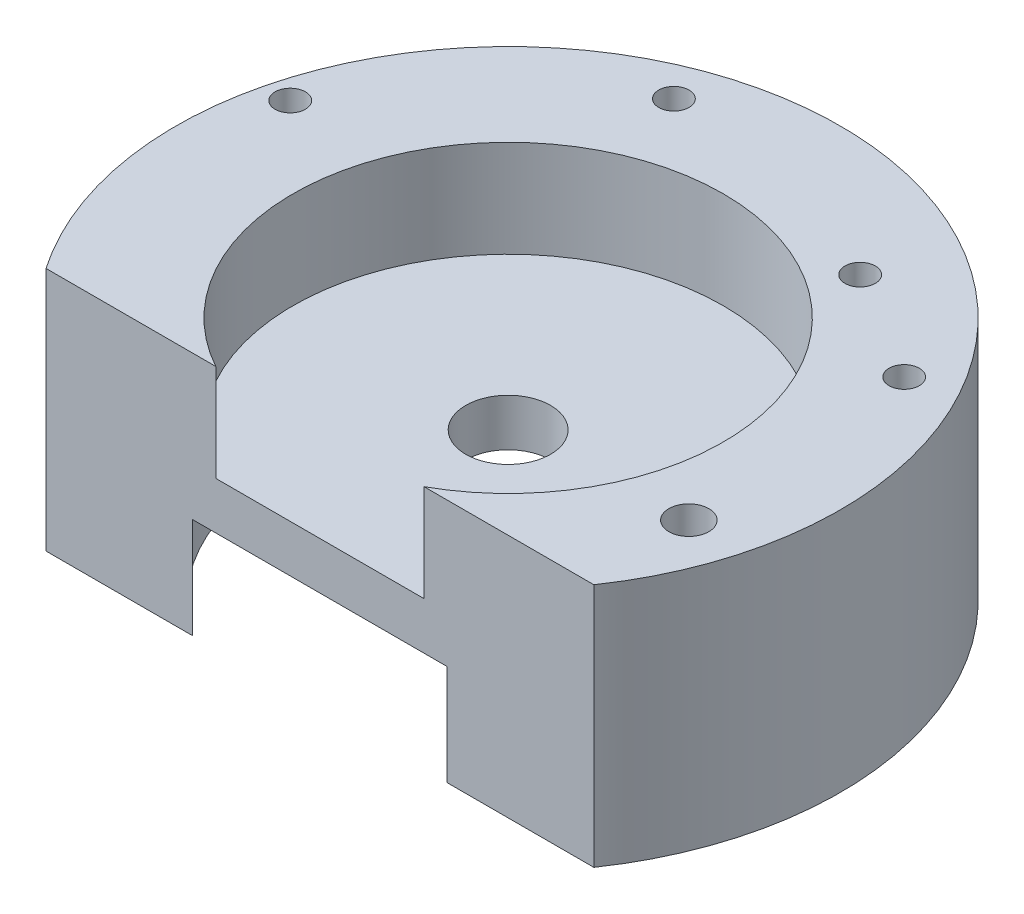
ISO-10303-21;
HEADER;
FILE_DESCRIPTION(('STEP AP214'),'2;1');
FILE_NAME('part.step','',(''),(''),'','','');
FILE_SCHEMA(('AUTOMOTIVE_DESIGN { 1 0 10303 214 1 1 1 1 }'));
ENDSEC;
DATA;
#1=APPLICATION_CONTEXT('core data for automotive mechanical design processes');
#2=APPLICATION_PROTOCOL_DEFINITION('international standard','automotive_design',2000,#1);
#3=PRODUCT_CONTEXT('',#1,'mechanical');
#4=PRODUCT('Part','Part','',(#3));
#5=PRODUCT_RELATED_PRODUCT_CATEGORY('part','',(#4));
#6=PRODUCT_DEFINITION_FORMATION('','',#4);
#7=PRODUCT_DEFINITION_CONTEXT('part definition',#1,'design');
#8=PRODUCT_DEFINITION('design','',#6,#7);
#9=PRODUCT_DEFINITION_SHAPE('','',#8);
#10=(LENGTH_UNIT() NAMED_UNIT(*) SI_UNIT(.MILLI.,.METRE.));
#11=(NAMED_UNIT(*) PLANE_ANGLE_UNIT() SI_UNIT($,.RADIAN.));
#12=(NAMED_UNIT(*) SI_UNIT($,.STERADIAN.) SOLID_ANGLE_UNIT());
#13=UNCERTAINTY_MEASURE_WITH_UNIT(LENGTH_MEASURE(1.E-05),#10,'distance_accuracy_value','');
#14=(GEOMETRIC_REPRESENTATION_CONTEXT(3) GLOBAL_UNCERTAINTY_ASSIGNED_CONTEXT((#13)) GLOBAL_UNIT_ASSIGNED_CONTEXT((#10,
#11,#12)) REPRESENTATION_CONTEXT('',''));
#15=CARTESIAN_POINT('',(0.,0.,0.));
#16=DIRECTION('',(0.,0.,1.));
#17=DIRECTION('',(1.,0.,0.));
#18=AXIS2_PLACEMENT_3D('',#15,#16,#17);
#19=CARTESIAN_POINT('',(0.,0.,0.));
#20=DIRECTION('',(0.,-1.,0.));
#21=DIRECTION('',(0.,0.,-1.));
#22=AXIS2_PLACEMENT_3D('',#19,#20,#21);
#23=CYLINDRICAL_SURFACE('',#22,27.425);
#24=CARTESIAN_POINT('',(0.,20.2,0.));
#25=DIRECTION('',(0.,-1.,0.));
#26=DIRECTION('',(0.,0.,-1.));
#27=AXIS2_PLACEMENT_3D('',#24,#25,#26);
#28=CIRCLE('',#27,27.425);
#29=CARTESIAN_POINT('',(-22.6032024126272,20.2,15.5314476367724));
#30=VERTEX_POINT('',#29);
#31=CARTESIAN_POINT('',(22.6032024126272,20.2,15.5314476367724));
#32=VERTEX_POINT('',#31);
#33=EDGE_CURVE('E131',#30,#32,#28,.T.);
#34=ORIENTED_EDGE('',*,*,#33,.T.);
#35=DIRECTION('',(0.,-1.,0.));
#36=VECTOR('',#35,1.);
#37=CARTESIAN_POINT('',(22.6032024126272,20.2,15.5314476367724));
#38=LINE('',#37,#36);
#39=CARTESIAN_POINT('',(22.6032024126272,0.,15.5314476367724));
#40=VERTEX_POINT('',#39);
#41=EDGE_CURVE('E53',#32,#40,#38,.T.);
#42=ORIENTED_EDGE('',*,*,#41,.T.);
#43=CARTESIAN_POINT('',(0.,0.,0.));
#44=DIRECTION('',(0.,-1.,0.));
#45=DIRECTION('',(0.,0.,-1.));
#46=AXIS2_PLACEMENT_3D('',#43,#44,#45);
#47=CIRCLE('',#46,27.425);
#48=CARTESIAN_POINT('',(-22.6032024126272,0.,15.5314476367724));
#49=VERTEX_POINT('',#48);
#50=EDGE_CURVE('E46',#49,#40,#47,.T.);
#51=ORIENTED_EDGE('',*,*,#50,.F.);
#52=DIRECTION('',(0.,-1.,0.));
#53=VECTOR('',#52,1.);
#54=CARTESIAN_POINT('',(-22.6032024126272,20.2,15.5314476367724));
#55=LINE('',#54,#53);
#56=EDGE_CURVE('E112',#30,#49,#55,.T.);
#57=ORIENTED_EDGE('',*,*,#56,.F.);
#58=EDGE_LOOP('',(#34,#42,#51,#57));
#59=FACE_BOUND('',#58,.T.);
#60=ADVANCED_FACE('F39',(#59),#23,.T.);
#61=CARTESIAN_POINT('',(-27.425,0.,0.));
#62=DIRECTION('',(0.,1.,0.));
#63=DIRECTION('',(0.,0.,1.));
#64=AXIS2_PLACEMENT_3D('',#61,#62,#63);
#65=PLANE('',#64);
#66=CARTESIAN_POINT('',(21.9096162425014,0.,6.99776507938924));
#67=DIRECTION('',(0.,-1.,0.));
#68=DIRECTION('',(0.,0.,-1.));
#69=AXIS2_PLACEMENT_3D('',#66,#67,#68);
#70=CIRCLE('',#69,1.65);
#71=CARTESIAN_POINT('',(21.9096162425014,0.,5.34776507938925));
#72=VERTEX_POINT('',#71);
#73=EDGE_CURVE('E196',#72,#72,#70,.T.);
#74=ORIENTED_EDGE('',*,*,#73,.F.);
#75=EDGE_LOOP('',(#74));
#76=FACE_BOUND('',#75,.T.);
#77=ORIENTED_EDGE('',*,*,#50,.T.);
#78=DIRECTION('',(1.,0.,0.));
#79=VECTOR('',#78,1.);
#80=CARTESIAN_POINT('',(22.6032024126272,0.,15.5314476367724));
#81=LINE('',#80,#79);
#82=CARTESIAN_POINT('',(10.5041246330286,0.,15.5314476367724));
#83=VERTEX_POINT('',#82);
#84=EDGE_CURVE('E100',#83,#40,#81,.T.);
#85=ORIENTED_EDGE('',*,*,#84,.F.);
#86=CARTESIAN_POINT('',(0.,0.,0.));
#87=DIRECTION('',(0.,-1.,0.));
#88=DIRECTION('',(0.,0.,-1.));
#89=AXIS2_PLACEMENT_3D('',#86,#87,#88);
#90=CIRCLE('',#89,18.75);
#91=CARTESIAN_POINT('',(-10.5041246330286,0.,15.5314476367724));
#92=VERTEX_POINT('',#91);
#93=EDGE_CURVE('E149',#92,#83,#90,.T.);
#94=ORIENTED_EDGE('',*,*,#93,.F.);
#95=EDGE_CURVE('E103',#49,#92,#81,.T.);
#96=ORIENTED_EDGE('',*,*,#95,.F.);
#97=EDGE_LOOP('',(#77,#85,#94,#96));
#98=FACE_BOUND('',#97,.T.);
#99=ADVANCED_FACE('F156',(#76,#98),#65,.F.);
#100=CARTESIAN_POINT('',(0.,0.,0.));
#101=DIRECTION('',(0.,-1.,0.));
#102=DIRECTION('',(0.,0.,-1.));
#103=AXIS2_PLACEMENT_3D('',#100,#101,#102);
#104=CYLINDRICAL_SURFACE('',#103,18.75);
#105=ORIENTED_EDGE('',*,*,#93,.T.);
#106=DIRECTION('',(0.,-1.,0.));
#107=VECTOR('',#106,1.);
#108=CARTESIAN_POINT('',(10.5041246330286,0.,15.5314476367724));
#109=LINE('',#108,#107);
#110=CARTESIAN_POINT('',(10.5041246330286,8.3,15.5314476367724));
#111=VERTEX_POINT('',#110);
#112=EDGE_CURVE('E128',#83,#111,#109,.F.);
#113=ORIENTED_EDGE('',*,*,#112,.T.);
#114=CARTESIAN_POINT('',(0.,8.3,0.));
#115=DIRECTION('',(0.,-1.,0.));
#116=DIRECTION('',(0.,0.,-1.));
#117=AXIS2_PLACEMENT_3D('',#114,#115,#116);
#118=CIRCLE('',#117,18.75);
#119=CARTESIAN_POINT('',(-10.5041246330286,8.3,15.5314476367724));
#120=VERTEX_POINT('',#119);
#121=EDGE_CURVE('E146',#120,#111,#118,.T.);
#122=ORIENTED_EDGE('',*,*,#121,.F.);
#123=DIRECTION('',(0.,-1.,0.));
#124=VECTOR('',#123,1.);
#125=CARTESIAN_POINT('',(-10.5041246330286,0.,15.5314476367724));
#126=LINE('',#125,#124);
#127=EDGE_CURVE('E59',#120,#92,#126,.T.);
#128=ORIENTED_EDGE('',*,*,#127,.T.);
#129=EDGE_LOOP('',(#105,#113,#122,#128));
#130=FACE_BOUND('',#129,.T.);
#131=ADVANCED_FACE('F172',(#130),#104,.F.);
#132=CARTESIAN_POINT('',(-18.75,8.3,0.));
#133=DIRECTION('',(0.,1.,0.));
#134=DIRECTION('',(0.,0.,1.));
#135=AXIS2_PLACEMENT_3D('',#132,#133,#134);
#136=PLANE('',#135);
#137=CARTESIAN_POINT('',(0.,8.3,0.));
#138=DIRECTION('',(0.,-1.,0.));
#139=DIRECTION('',(0.,0.,-1.));
#140=AXIS2_PLACEMENT_3D('',#137,#138,#139);
#141=CIRCLE('',#140,3.5);
#142=CARTESIAN_POINT('',(0.,8.3,-3.5));
#143=VERTEX_POINT('',#142);
#144=EDGE_CURVE('E143',#143,#143,#141,.T.);
#145=ORIENTED_EDGE('',*,*,#144,.F.);
#146=EDGE_LOOP('',(#145));
#147=FACE_BOUND('',#146,.T.);
#148=ORIENTED_EDGE('',*,*,#121,.T.);
#149=DIRECTION('',(-1.,0.,0.));
#150=VECTOR('',#149,1.);
#151=CARTESIAN_POINT('',(-18.75,8.3,15.5314476367724));
#152=LINE('',#151,#150);
#153=EDGE_CURVE('E125',#111,#120,#152,.T.);
#154=ORIENTED_EDGE('',*,*,#153,.T.);
#155=EDGE_LOOP('',(#148,#154));
#156=FACE_BOUND('',#155,.T.);
#157=ADVANCED_FACE('F174',(#147,#156),#136,.F.);
#158=CARTESIAN_POINT('',(0.,0.,0.));
#159=DIRECTION('',(0.,-1.,0.));
#160=DIRECTION('',(0.,0.,-1.));
#161=AXIS2_PLACEMENT_3D('',#158,#159,#160);
#162=CYLINDRICAL_SURFACE('',#161,3.5);
#163=CARTESIAN_POINT('',(0.,12.2,0.));
#164=DIRECTION('',(0.,-1.,0.));
#165=DIRECTION('',(0.,0.,-1.));
#166=AXIS2_PLACEMENT_3D('',#163,#164,#165);
#167=CIRCLE('',#166,3.5);
#168=CARTESIAN_POINT('',(0.,12.2,-3.5));
#169=VERTEX_POINT('',#168);
#170=EDGE_CURVE('E140',#169,#169,#167,.T.);
#171=ORIENTED_EDGE('',*,*,#170,.F.);
#172=EDGE_LOOP('',(#171));
#173=FACE_BOUND('',#172,.T.);
#174=ORIENTED_EDGE('',*,*,#144,.T.);
#175=EDGE_LOOP('',(#174));
#176=FACE_BOUND('',#175,.T.);
#177=ADVANCED_FACE('F176',(#173,#176),#162,.F.);
#178=CARTESIAN_POINT('',(-3.5,12.2,0.));
#179=DIRECTION('',(0.,-1.,0.));
#180=DIRECTION('',(0.,0.,-1.));
#181=AXIS2_PLACEMENT_3D('',#178,#179,#180);
#182=PLANE('',#181);
#183=CARTESIAN_POINT('',(0.,12.2,0.));
#184=DIRECTION('',(0.,-1.,0.));
#185=DIRECTION('',(0.,0.,-1.));
#186=AXIS2_PLACEMENT_3D('',#183,#184,#185);
#187=CIRCLE('',#186,17.75);
#188=CARTESIAN_POINT('',(-8.59282458253381,12.2,15.5314476367724));
#189=VERTEX_POINT('',#188);
#190=CARTESIAN_POINT('',(8.59282458253381,12.2,15.5314476367724));
#191=VERTEX_POINT('',#190);
#192=EDGE_CURVE('E137',#189,#191,#187,.T.);
#193=ORIENTED_EDGE('',*,*,#192,.F.);
#194=DIRECTION('',(1.,0.,0.));
#195=VECTOR('',#194,1.);
#196=CARTESIAN_POINT('',(-3.5,12.2,15.5314476367724));
#197=LINE('',#196,#195);
#198=EDGE_CURVE('E119',#189,#191,#197,.T.);
#199=ORIENTED_EDGE('',*,*,#198,.T.);
#200=EDGE_LOOP('',(#193,#199));
#201=FACE_BOUND('',#200,.T.);
#202=ORIENTED_EDGE('',*,*,#170,.T.);
#203=EDGE_LOOP('',(#202));
#204=FACE_BOUND('',#203,.T.);
#205=ADVANCED_FACE('F168',(#201,#204),#182,.F.);
#206=CARTESIAN_POINT('',(0.,0.,0.));
#207=DIRECTION('',(0.,-1.,0.));
#208=DIRECTION('',(0.,0.,-1.));
#209=AXIS2_PLACEMENT_3D('',#206,#207,#208);
#210=CYLINDRICAL_SURFACE('',#209,17.75);
#211=ORIENTED_EDGE('',*,*,#192,.T.);
#212=DIRECTION('',(0.,-1.,0.));
#213=VECTOR('',#212,1.);
#214=CARTESIAN_POINT('',(8.59282458253381,0.,15.5314476367724));
#215=LINE('',#214,#213);
#216=CARTESIAN_POINT('',(8.59282458253382,20.2,15.5314476367724));
#217=VERTEX_POINT('',#216);
#218=EDGE_CURVE('E122',#191,#217,#215,.F.);
#219=ORIENTED_EDGE('',*,*,#218,.T.);
#220=CARTESIAN_POINT('',(0.,20.2,0.));
#221=DIRECTION('',(0.,-1.,0.));
#222=DIRECTION('',(0.,0.,-1.));
#223=AXIS2_PLACEMENT_3D('',#220,#221,#222);
#224=CIRCLE('',#223,17.75);
#225=CARTESIAN_POINT('',(-8.59282458253382,20.2,15.5314476367724));
#226=VERTEX_POINT('',#225);
#227=EDGE_CURVE('E134',#226,#217,#224,.T.);
#228=ORIENTED_EDGE('',*,*,#227,.F.);
#229=DIRECTION('',(0.,-1.,0.));
#230=VECTOR('',#229,1.);
#231=CARTESIAN_POINT('',(-8.59282458253381,0.,15.5314476367724));
#232=LINE('',#231,#230);
#233=EDGE_CURVE('E115',#226,#189,#232,.T.);
#234=ORIENTED_EDGE('',*,*,#233,.T.);
#235=EDGE_LOOP('',(#211,#219,#228,#234));
#236=FACE_BOUND('',#235,.T.);
#237=ADVANCED_FACE('F165',(#236),#210,.F.);
#238=CARTESIAN_POINT('',(-17.75,20.2,0.));
#239=DIRECTION('',(0.,-1.,0.));
#240=DIRECTION('',(0.,0.,-1.));
#241=AXIS2_PLACEMENT_3D('',#238,#239,#240);
#242=PLANE('',#241);
#243=CARTESIAN_POINT('',(21.9096162425014,20.2,6.99776507938924));
#244=DIRECTION('',(0.,-1.,0.));
#245=DIRECTION('',(0.,0.,-1.));
#246=AXIS2_PLACEMENT_3D('',#243,#244,#245);
#247=CIRCLE('',#246,1.65);
#248=CARTESIAN_POINT('',(21.9096162425014,20.2,5.34776507938925));
#249=VERTEX_POINT('',#248);
#250=EDGE_CURVE('E198',#249,#249,#247,.T.);
#251=ORIENTED_EDGE('',*,*,#250,.T.);
#252=EDGE_LOOP('',(#251));
#253=FACE_BOUND('',#252,.T.);
#254=CARTESIAN_POINT('',(20.5618746377783,20.2,-12.1185523632276));
#255=DIRECTION('',(0.,-1.,0.));
#256=DIRECTION('',(0.,0.,-1.));
#257=AXIS2_PLACEMENT_3D('',#254,#255,#256);
#258=CIRCLE('',#257,1.25);
#259=CARTESIAN_POINT('',(20.5618746377783,20.2,-13.3685523632276));
#260=VERTEX_POINT('',#259);
#261=EDGE_CURVE('E206',#260,#260,#258,.T.);
#262=ORIENTED_EDGE('',*,*,#261,.T.);
#263=EDGE_LOOP('',(#262));
#264=FACE_BOUND('',#263,.T.);
#265=CARTESIAN_POINT('',(-8.82232836780858,20.2,-22.5009226959821));
#266=DIRECTION('',(0.,-1.,0.));
#267=DIRECTION('',(0.,0.,-1.));
#268=AXIS2_PLACEMENT_3D('',#265,#266,#267);
#269=CIRCLE('',#268,1.25);
#270=CARTESIAN_POINT('',(-8.82232836780858,20.2,-23.7509226959821));
#271=VERTEX_POINT('',#270);
#272=EDGE_CURVE('E212',#271,#271,#269,.T.);
#273=ORIENTED_EDGE('',*,*,#272,.T.);
#274=EDGE_LOOP('',(#273));
#275=FACE_BOUND('',#274,.T.);
#276=CARTESIAN_POINT('',(-24.5224357736982,20.2,-6.54106594714093));
#277=DIRECTION('',(0.,-1.,0.));
#278=DIRECTION('',(0.,0.,-1.));
#279=AXIS2_PLACEMENT_3D('',#276,#277,#278);
#280=CIRCLE('',#279,1.25);
#281=CARTESIAN_POINT('',(-24.5224357736982,20.2,-7.79106594714093));
#282=VERTEX_POINT('',#281);
#283=EDGE_CURVE('E201',#282,#282,#280,.T.);
#284=ORIENTED_EDGE('',*,*,#283,.T.);
#285=EDGE_LOOP('',(#284));
#286=FACE_BOUND('',#285,.T.);
#287=CARTESIAN_POINT('',(11.4353989661859,20.2,-17.6133940648631));
#288=DIRECTION('',(0.,1.,0.));
#289=DIRECTION('',(0.,0.,1.));
#290=AXIS2_PLACEMENT_3D('',#287,#288,#289);
#291=CIRCLE('',#290,1.24999999999999);
#292=CARTESIAN_POINT('',(11.4353989661859,20.2,-16.3633940648631));
#293=VERTEX_POINT('',#292);
#294=EDGE_CURVE('E101',#293,#293,#291,.T.);
#295=ORIENTED_EDGE('',*,*,#294,.F.);
#296=EDGE_LOOP('',(#295));
#297=FACE_BOUND('',#296,.T.);
#298=ORIENTED_EDGE('',*,*,#33,.F.);
#299=DIRECTION('',(1.,0.,0.));
#300=VECTOR('',#299,1.);
#301=CARTESIAN_POINT('',(22.6032024126272,20.2,15.5314476367724));
#302=LINE('',#301,#300);
#303=EDGE_CURVE('E110',#30,#226,#302,.T.);
#304=ORIENTED_EDGE('',*,*,#303,.T.);
#305=ORIENTED_EDGE('',*,*,#227,.T.);
#306=DIRECTION('',(1.,0.,0.));
#307=VECTOR('',#306,1.);
#308=CARTESIAN_POINT('',(-17.75,20.2,15.5314476367724));
#309=LINE('',#308,#307);
#310=EDGE_CURVE('E11',#217,#32,#309,.T.);
#311=ORIENTED_EDGE('',*,*,#310,.T.);
#312=EDGE_LOOP('',(#298,#304,#305,#311));
#313=FACE_BOUND('',#312,.T.);
#314=ADVANCED_FACE('F162',(#253,#264,#275,#286,#297,#313),#242,.F.);
#315=CARTESIAN_POINT('',(22.6032024126272,20.2,15.5314476367724));
#316=DIRECTION('',(0.,0.,-1.));
#317=DIRECTION('',(-1.,0.,0.));
#318=AXIS2_PLACEMENT_3D('',#315,#316,#317);
#319=PLANE('',#318);
#320=ORIENTED_EDGE('',*,*,#84,.T.);
#321=ORIENTED_EDGE('',*,*,#41,.F.);
#322=ORIENTED_EDGE('',*,*,#310,.F.);
#323=ORIENTED_EDGE('',*,*,#218,.F.);
#324=ORIENTED_EDGE('',*,*,#198,.F.);
#325=ORIENTED_EDGE('',*,*,#233,.F.);
#326=ORIENTED_EDGE('',*,*,#303,.F.);
#327=ORIENTED_EDGE('',*,*,#56,.T.);
#328=ORIENTED_EDGE('',*,*,#95,.T.);
#329=ORIENTED_EDGE('',*,*,#127,.F.);
#330=ORIENTED_EDGE('',*,*,#153,.F.);
#331=ORIENTED_EDGE('',*,*,#112,.F.);
#332=EDGE_LOOP('',(#320,#321,#322,#323,#324,#325,#326,#327,#328,#329,#330,#331));
#333=FACE_BOUND('',#332,.T.);
#334=ADVANCED_FACE('F94',(#333),#319,.F.);
#335=CARTESIAN_POINT('',(11.4353989661859,5.2,-17.6133940648631));
#336=DIRECTION('',(0.,1.,0.));
#337=DIRECTION('',(0.,0.,1.));
#338=AXIS2_PLACEMENT_3D('',#335,#336,#337);
#339=CONICAL_SURFACE('',#338,1.25,1.02974425867665);
#340=CARTESIAN_POINT('',(11.4353989661859,4.44892422621555,-17.6133940648631));
#341=VERTEX_POINT('',#340);
#342=VERTEX_LOOP('',#341);
#343=FACE_BOUND('',#342,.T.);
#344=CARTESIAN_POINT('',(11.4353989661859,5.2,-17.6133940648631));
#345=DIRECTION('',(0.,1.,0.));
#346=DIRECTION('',(0.,0.,1.));
#347=AXIS2_PLACEMENT_3D('',#344,#345,#346);
#348=CIRCLE('',#347,1.25);
#349=CARTESIAN_POINT('',(11.4353989661859,5.2,-16.3633940648631));
#350=VERTEX_POINT('',#349);
#351=EDGE_CURVE('E98',#350,#350,#348,.T.);
#352=ORIENTED_EDGE('',*,*,#351,.T.);
#353=EDGE_LOOP('',(#352));
#354=FACE_BOUND('',#353,.T.);
#355=ADVANCED_FACE('F90',(#343,#354),#339,.F.);
#356=CARTESIAN_POINT('',(11.4353989661859,20.2,-17.6133940648631));
#357=DIRECTION('',(0.,1.,0.));
#358=DIRECTION('',(0.,0.,1.));
#359=AXIS2_PLACEMENT_3D('',#356,#357,#358);
#360=CYLINDRICAL_SURFACE('',#359,1.24999999999999);
#361=ORIENTED_EDGE('',*,*,#351,.F.);
#362=EDGE_LOOP('',(#361));
#363=FACE_BOUND('',#362,.T.);
#364=ORIENTED_EDGE('',*,*,#294,.T.);
#365=EDGE_LOOP('',(#364));
#366=FACE_BOUND('',#365,.T.);
#367=ADVANCED_FACE('F93',(#363,#366),#360,.F.);
#368=CARTESIAN_POINT('',(-24.5224357736982,10.2,-6.54106594714093));
#369=DIRECTION('',(0.,1.,0.));
#370=DIRECTION('',(0.,0.,1.));
#371=AXIS2_PLACEMENT_3D('',#368,#369,#370);
#372=CYLINDRICAL_SURFACE('',#371,1.25);
#373=CARTESIAN_POINT('',(-24.5224357736982,10.2,-6.54106594714093));
#374=DIRECTION('',(0.,-1.,0.));
#375=DIRECTION('',(0.,0.,-1.));
#376=AXIS2_PLACEMENT_3D('',#373,#374,#375);
#377=CIRCLE('',#376,1.25);
#378=CARTESIAN_POINT('',(-24.5224357736982,10.2,-7.79106594714093));
#379=VERTEX_POINT('',#378);
#380=EDGE_CURVE('E215',#379,#379,#377,.T.);
#381=ORIENTED_EDGE('',*,*,#380,.T.);
#382=EDGE_LOOP('',(#381));
#383=FACE_BOUND('',#382,.T.);
#384=ORIENTED_EDGE('',*,*,#283,.F.);
#385=EDGE_LOOP('',(#384));
#386=FACE_BOUND('',#385,.T.);
#387=ADVANCED_FACE('F222',(#383,#386),#372,.F.);
#388=CARTESIAN_POINT('',(-24.5224357736982,10.2,-6.54106594714093));
#389=DIRECTION('',(0.,-1.,0.));
#390=DIRECTION('',(0.,0.,-1.));
#391=AXIS2_PLACEMENT_3D('',#388,#389,#390);
#392=PLANE('',#391);
#393=ORIENTED_EDGE('',*,*,#380,.F.);
#394=EDGE_LOOP('',(#393));
#395=FACE_BOUND('',#394,.T.);
#396=ADVANCED_FACE('F224',(#395),#392,.F.);
#397=CARTESIAN_POINT('',(-8.82232836780858,10.2,-22.5009226959821));
#398=DIRECTION('',(0.,1.,0.));
#399=DIRECTION('',(0.,0.,1.));
#400=AXIS2_PLACEMENT_3D('',#397,#398,#399);
#401=CYLINDRICAL_SURFACE('',#400,1.25);
#402=CARTESIAN_POINT('',(-8.82232836780858,10.2,-22.5009226959821));
#403=DIRECTION('',(0.,-1.,0.));
#404=DIRECTION('',(0.,0.,-1.));
#405=AXIS2_PLACEMENT_3D('',#402,#403,#404);
#406=CIRCLE('',#405,1.25);
#407=CARTESIAN_POINT('',(-8.82232836780858,10.2,-23.7509226959821));
#408=VERTEX_POINT('',#407);
#409=EDGE_CURVE('E209',#408,#408,#406,.T.);
#410=ORIENTED_EDGE('',*,*,#409,.T.);
#411=EDGE_LOOP('',(#410));
#412=FACE_BOUND('',#411,.T.);
#413=ORIENTED_EDGE('',*,*,#272,.F.);
#414=EDGE_LOOP('',(#413));
#415=FACE_BOUND('',#414,.T.);
#416=ADVANCED_FACE('F231',(#412,#415),#401,.F.);
#417=CARTESIAN_POINT('',(-8.82232836780858,10.2,-22.5009226959821));
#418=DIRECTION('',(0.,-1.,0.));
#419=DIRECTION('',(0.,0.,-1.));
#420=AXIS2_PLACEMENT_3D('',#417,#418,#419);
#421=PLANE('',#420);
#422=ORIENTED_EDGE('',*,*,#409,.F.);
#423=EDGE_LOOP('',(#422));
#424=FACE_BOUND('',#423,.T.);
#425=ADVANCED_FACE('F312',(#424),#421,.F.);
#426=CARTESIAN_POINT('',(20.5618746377783,10.2,-12.1185523632276));
#427=DIRECTION('',(0.,1.,0.));
#428=DIRECTION('',(0.,0.,1.));
#429=AXIS2_PLACEMENT_3D('',#426,#427,#428);
#430=CYLINDRICAL_SURFACE('',#429,1.25);
#431=CARTESIAN_POINT('',(20.5618746377783,10.2,-12.1185523632276));
#432=DIRECTION('',(0.,-1.,0.));
#433=DIRECTION('',(0.,0.,-1.));
#434=AXIS2_PLACEMENT_3D('',#431,#432,#433);
#435=CIRCLE('',#434,1.25);
#436=CARTESIAN_POINT('',(20.5618746377783,10.2,-13.3685523632276));
#437=VERTEX_POINT('',#436);
#438=EDGE_CURVE('E106',#437,#437,#435,.T.);
#439=ORIENTED_EDGE('',*,*,#438,.T.);
#440=EDGE_LOOP('',(#439));
#441=FACE_BOUND('',#440,.T.);
#442=ORIENTED_EDGE('',*,*,#261,.F.);
#443=EDGE_LOOP('',(#442));
#444=FACE_BOUND('',#443,.T.);
#445=ADVANCED_FACE('F301',(#441,#444),#430,.F.);
#446=CARTESIAN_POINT('',(20.5618746377783,10.2,-12.1185523632276));
#447=DIRECTION('',(0.,-1.,0.));
#448=DIRECTION('',(0.,0.,-1.));
#449=AXIS2_PLACEMENT_3D('',#446,#447,#448);
#450=PLANE('',#449);
#451=ORIENTED_EDGE('',*,*,#438,.F.);
#452=EDGE_LOOP('',(#451));
#453=FACE_BOUND('',#452,.T.);
#454=ADVANCED_FACE('F283',(#453),#450,.F.);
#455=CARTESIAN_POINT('',(21.9096162425014,0.,6.99776507938924));
#456=DIRECTION('',(0.,-1.,0.));
#457=DIRECTION('',(0.,0.,-1.));
#458=AXIS2_PLACEMENT_3D('',#455,#456,#457);
#459=CYLINDRICAL_SURFACE('',#458,1.65);
#460=ORIENTED_EDGE('',*,*,#250,.F.);
#461=EDGE_LOOP('',(#460));
#462=FACE_BOUND('',#461,.T.);
#463=ORIENTED_EDGE('',*,*,#73,.T.);
#464=EDGE_LOOP('',(#463));
#465=FACE_BOUND('',#464,.T.);
#466=ADVANCED_FACE('F279',(#462,#465),#459,.F.);
#467=CLOSED_SHELL('',(#60,#99,#131,#157,#177,#205,#237,#314,#334,#355,#367,#387,#396,#416,#425,
#445,#454,#466));
#468=MANIFOLD_SOLID_BREP('B2',#467);
#469=ADVANCED_BREP_SHAPE_REPRESENTATION('',(#18,#468),#14);
#470=SHAPE_DEFINITION_REPRESENTATION(#9,#469);
ENDSEC;
END-ISO-10303-21;
